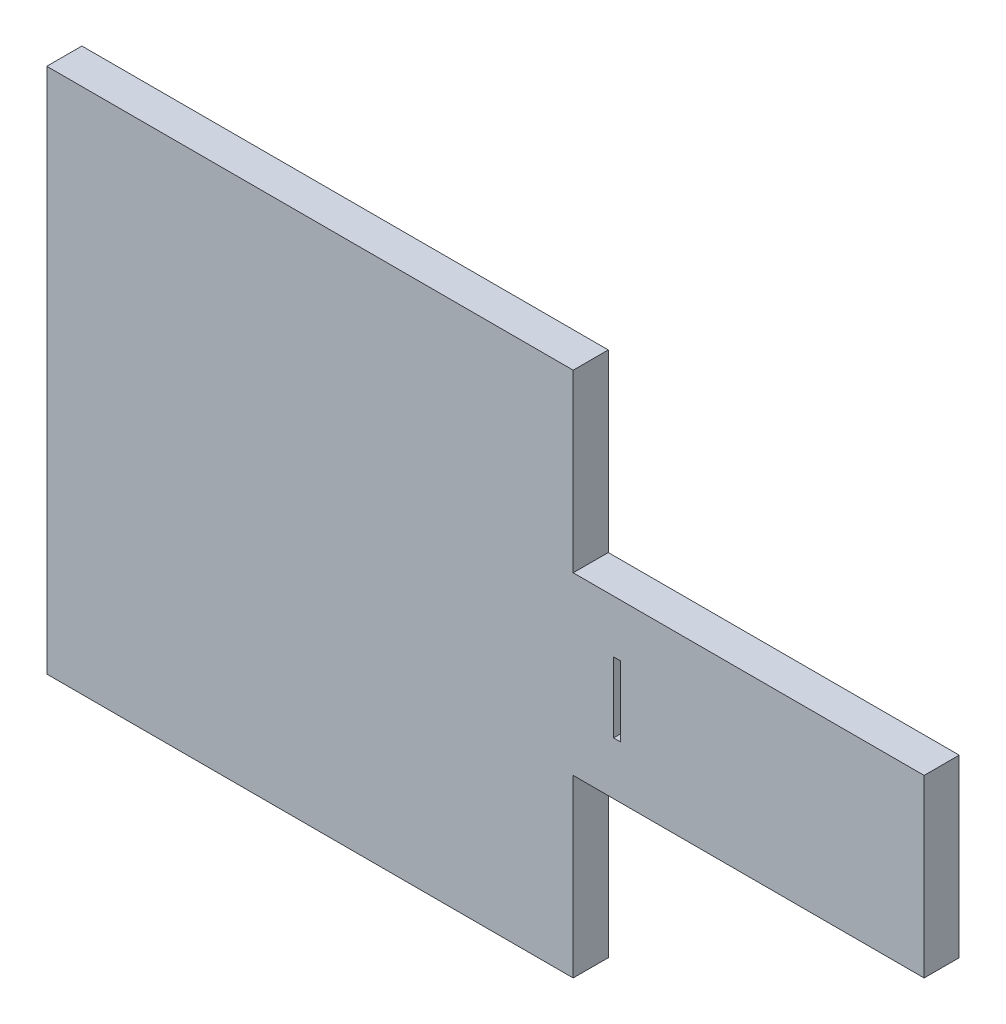
ISO-10303-21;
HEADER;
FILE_DESCRIPTION(('STEP AP214'),'2;1');
FILE_NAME('part.step','',(''),(''),'','','');
FILE_SCHEMA(('AUTOMOTIVE_DESIGN { 1 0 10303 214 1 1 1 1 }'));
ENDSEC;
DATA;
#1=APPLICATION_CONTEXT('core data for automotive mechanical design processes');
#2=APPLICATION_PROTOCOL_DEFINITION('international standard','automotive_design',2000,#1);
#3=PRODUCT_CONTEXT('',#1,'mechanical');
#4=PRODUCT('Part','Part','',(#3));
#5=PRODUCT_RELATED_PRODUCT_CATEGORY('part','',(#4));
#6=PRODUCT_DEFINITION_FORMATION('','',#4);
#7=PRODUCT_DEFINITION_CONTEXT('part definition',#1,'design');
#8=PRODUCT_DEFINITION('design','',#6,#7);
#9=PRODUCT_DEFINITION_SHAPE('','',#8);
#10=(LENGTH_UNIT() NAMED_UNIT(*) SI_UNIT(.MILLI.,.METRE.));
#11=(NAMED_UNIT(*) PLANE_ANGLE_UNIT() SI_UNIT($,.RADIAN.));
#12=(NAMED_UNIT(*) SI_UNIT($,.STERADIAN.) SOLID_ANGLE_UNIT());
#13=UNCERTAINTY_MEASURE_WITH_UNIT(LENGTH_MEASURE(1.E-05),#10,'distance_accuracy_value','');
#14=(GEOMETRIC_REPRESENTATION_CONTEXT(3) GLOBAL_UNCERTAINTY_ASSIGNED_CONTEXT((#13)) GLOBAL_UNIT_ASSIGNED_CONTEXT((#10,
#11,#12)) REPRESENTATION_CONTEXT('',''));
#15=CARTESIAN_POINT('',(0.,0.,0.));
#16=DIRECTION('',(0.,0.,1.));
#17=DIRECTION('',(1.,0.,0.));
#18=AXIS2_PLACEMENT_3D('',#15,#16,#17);
#19=CARTESIAN_POINT('',(0.,0.,2.54));
#20=DIRECTION('',(0.,0.,1.));
#21=DIRECTION('',(1.,0.,0.));
#22=AXIS2_PLACEMENT_3D('',#19,#20,#21);
#23=PLANE('',#22);
#24=DIRECTION('',(0.,1.,0.));
#25=VECTOR('',#24,1.);
#26=CARTESIAN_POINT('',(19.05,0.,2.54));
#27=LINE('',#26,#25);
#28=CARTESIAN_POINT('',(19.05,0.,2.54));
#29=VERTEX_POINT('',#28);
#30=CARTESIAN_POINT('',(19.05,12.7,2.54));
#31=VERTEX_POINT('',#30);
#32=EDGE_CURVE('E198',#29,#31,#27,.T.);
#33=ORIENTED_EDGE('',*,*,#32,.T.);
#34=DIRECTION('',(-1.,0.,0.));
#35=VECTOR('',#34,1.);
#36=CARTESIAN_POINT('',(19.05,12.7,2.54));
#37=LINE('',#36,#35);
#38=CARTESIAN_POINT('',(-6.35,12.7,2.54));
#39=VERTEX_POINT('',#38);
#40=EDGE_CURVE('E202',#31,#39,#37,.T.);
#41=ORIENTED_EDGE('',*,*,#40,.T.);
#42=DIRECTION('',(0.,1.,0.));
#43=VECTOR('',#42,1.);
#44=CARTESIAN_POINT('',(-6.35,12.7,2.54));
#45=LINE('',#44,#43);
#46=CARTESIAN_POINT('',(-6.35,25.4,2.54));
#47=VERTEX_POINT('',#46);
#48=EDGE_CURVE('E206',#39,#47,#45,.T.);
#49=ORIENTED_EDGE('',*,*,#48,.T.);
#50=DIRECTION('',(-1.,0.,0.));
#51=VECTOR('',#50,1.);
#52=CARTESIAN_POINT('',(-6.35,25.4,2.54));
#53=LINE('',#52,#51);
#54=CARTESIAN_POINT('',(-44.45,25.4,2.54));
#55=VERTEX_POINT('',#54);
#56=EDGE_CURVE('E209',#47,#55,#53,.T.);
#57=ORIENTED_EDGE('',*,*,#56,.T.);
#58=DIRECTION('',(0.,-1.,0.));
#59=VECTOR('',#58,1.);
#60=CARTESIAN_POINT('',(-44.45,-12.7,2.54));
#61=LINE('',#60,#59);
#62=CARTESIAN_POINT('',(-44.45,-12.7,2.54));
#63=VERTEX_POINT('',#62);
#64=EDGE_CURVE('E212',#55,#63,#61,.T.);
#65=ORIENTED_EDGE('',*,*,#64,.T.);
#66=DIRECTION('',(1.,0.,0.));
#67=VECTOR('',#66,1.);
#68=CARTESIAN_POINT('',(-44.45,-12.7,2.54));
#69=LINE('',#68,#67);
#70=CARTESIAN_POINT('',(-6.35,-12.7,2.54));
#71=VERTEX_POINT('',#70);
#72=EDGE_CURVE('E215',#63,#71,#69,.T.);
#73=ORIENTED_EDGE('',*,*,#72,.T.);
#74=DIRECTION('',(0.,1.,0.));
#75=VECTOR('',#74,1.);
#76=CARTESIAN_POINT('',(-6.35,-12.7,2.54));
#77=LINE('',#76,#75);
#78=CARTESIAN_POINT('',(-6.35,0.,2.54));
#79=VERTEX_POINT('',#78);
#80=EDGE_CURVE('E218',#71,#79,#77,.T.);
#81=ORIENTED_EDGE('',*,*,#80,.T.);
#82=DIRECTION('',(1.,0.,0.));
#83=VECTOR('',#82,1.);
#84=CARTESIAN_POINT('',(-6.35,0.,2.54));
#85=LINE('',#84,#83);
#86=EDGE_CURVE('E221',#79,#29,#85,.T.);
#87=ORIENTED_EDGE('',*,*,#86,.T.);
#88=EDGE_LOOP('',(#33,#41,#49,#57,#65,#73,#81,#87));
#89=FACE_BOUND('',#88,.T.);
#90=DIRECTION('',(-1.,0.,0.));
#91=VECTOR('',#90,1.);
#92=CARTESIAN_POINT('',(-3.429,8.89,2.54));
#93=LINE('',#92,#91);
#94=CARTESIAN_POINT('',(-2.921,8.89,2.54));
#95=VERTEX_POINT('',#94);
#96=CARTESIAN_POINT('',(-3.429,8.89,2.54));
#97=VERTEX_POINT('',#96);
#98=EDGE_CURVE('E159',#95,#97,#93,.T.);
#99=ORIENTED_EDGE('',*,*,#98,.F.);
#100=DIRECTION('',(0.,1.,0.));
#101=VECTOR('',#100,1.);
#102=CARTESIAN_POINT('',(-2.921,8.89,2.54));
#103=LINE('',#102,#101);
#104=CARTESIAN_POINT('',(-2.921,3.81,2.54));
#105=VERTEX_POINT('',#104);
#106=EDGE_CURVE('E150',#105,#95,#103,.T.);
#107=ORIENTED_EDGE('',*,*,#106,.F.);
#108=DIRECTION('',(1.,0.,0.));
#109=VECTOR('',#108,1.);
#110=CARTESIAN_POINT('',(-3.429,3.81,2.54));
#111=LINE('',#110,#109);
#112=CARTESIAN_POINT('',(-3.429,3.81,2.54));
#113=VERTEX_POINT('',#112);
#114=EDGE_CURVE('E176',#113,#105,#111,.T.);
#115=ORIENTED_EDGE('',*,*,#114,.F.);
#116=DIRECTION('',(0.,-1.,0.));
#117=VECTOR('',#116,1.);
#118=CARTESIAN_POINT('',(-3.429,8.89,2.54));
#119=LINE('',#118,#117);
#120=EDGE_CURVE('E172',#97,#113,#119,.T.);
#121=ORIENTED_EDGE('',*,*,#120,.F.);
#122=EDGE_LOOP('',(#99,#107,#115,#121));
#123=FACE_BOUND('',#122,.T.);
#124=ADVANCED_FACE('F36',(#89,#123),#23,.T.);
#125=CARTESIAN_POINT('',(0.,0.,0.));
#126=DIRECTION('',(0.,0.,1.));
#127=DIRECTION('',(1.,0.,0.));
#128=AXIS2_PLACEMENT_3D('',#125,#126,#127);
#129=PLANE('',#128);
#130=DIRECTION('',(0.,1.,0.));
#131=VECTOR('',#130,1.);
#132=CARTESIAN_POINT('',(19.05,0.,0.));
#133=LINE('',#132,#131);
#134=CARTESIAN_POINT('',(19.05,0.,0.));
#135=VERTEX_POINT('',#134);
#136=CARTESIAN_POINT('',(19.05,12.7,0.));
#137=VERTEX_POINT('',#136);
#138=EDGE_CURVE('E168',#135,#137,#133,.T.);
#139=ORIENTED_EDGE('',*,*,#138,.F.);
#140=DIRECTION('',(1.,0.,0.));
#141=VECTOR('',#140,1.);
#142=CARTESIAN_POINT('',(-6.35,0.,0.));
#143=LINE('',#142,#141);
#144=CARTESIAN_POINT('',(-6.35,0.,0.));
#145=VERTEX_POINT('',#144);
#146=EDGE_CURVE('E203',#145,#135,#143,.T.);
#147=ORIENTED_EDGE('',*,*,#146,.F.);
#148=DIRECTION('',(0.,1.,0.));
#149=VECTOR('',#148,1.);
#150=CARTESIAN_POINT('',(-6.35,-12.7,0.));
#151=LINE('',#150,#149);
#152=CARTESIAN_POINT('',(-6.35,-12.7,0.));
#153=VERTEX_POINT('',#152);
#154=EDGE_CURVE('E243',#153,#145,#151,.T.);
#155=ORIENTED_EDGE('',*,*,#154,.F.);
#156=DIRECTION('',(1.,0.,0.));
#157=VECTOR('',#156,1.);
#158=CARTESIAN_POINT('',(-44.45,-12.7,0.));
#159=LINE('',#158,#157);
#160=CARTESIAN_POINT('',(-44.45,-12.7,0.));
#161=VERTEX_POINT('',#160);
#162=EDGE_CURVE('E240',#161,#153,#159,.T.);
#163=ORIENTED_EDGE('',*,*,#162,.F.);
#164=DIRECTION('',(0.,-1.,0.));
#165=VECTOR('',#164,1.);
#166=CARTESIAN_POINT('',(-44.45,-12.7,0.));
#167=LINE('',#166,#165);
#168=CARTESIAN_POINT('',(-44.45,25.4,0.));
#169=VERTEX_POINT('',#168);
#170=EDGE_CURVE('E237',#169,#161,#167,.T.);
#171=ORIENTED_EDGE('',*,*,#170,.F.);
#172=DIRECTION('',(-1.,0.,0.));
#173=VECTOR('',#172,1.);
#174=CARTESIAN_POINT('',(-6.35,25.4,0.));
#175=LINE('',#174,#173);
#176=CARTESIAN_POINT('',(-6.35,25.4,0.));
#177=VERTEX_POINT('',#176);
#178=EDGE_CURVE('E234',#177,#169,#175,.T.);
#179=ORIENTED_EDGE('',*,*,#178,.F.);
#180=DIRECTION('',(0.,1.,0.));
#181=VECTOR('',#180,1.);
#182=CARTESIAN_POINT('',(-6.35,12.7,0.));
#183=LINE('',#182,#181);
#184=CARTESIAN_POINT('',(-6.35,12.7,0.));
#185=VERTEX_POINT('',#184);
#186=EDGE_CURVE('E231',#185,#177,#183,.T.);
#187=ORIENTED_EDGE('',*,*,#186,.F.);
#188=DIRECTION('',(-1.,0.,0.));
#189=VECTOR('',#188,1.);
#190=CARTESIAN_POINT('',(19.05,12.7,0.));
#191=LINE('',#190,#189);
#192=EDGE_CURVE('E228',#137,#185,#191,.T.);
#193=ORIENTED_EDGE('',*,*,#192,.F.);
#194=EDGE_LOOP('',(#139,#147,#155,#163,#171,#179,#187,#193));
#195=FACE_BOUND('',#194,.T.);
#196=DIRECTION('',(0.,1.,0.));
#197=VECTOR('',#196,1.);
#198=CARTESIAN_POINT('',(-2.921,8.89,0.));
#199=LINE('',#198,#197);
#200=CARTESIAN_POINT('',(-2.921,3.81,0.));
#201=VERTEX_POINT('',#200);
#202=CARTESIAN_POINT('',(-2.921,8.89,0.));
#203=VERTEX_POINT('',#202);
#204=EDGE_CURVE('E66',#201,#203,#199,.T.);
#205=ORIENTED_EDGE('',*,*,#204,.T.);
#206=DIRECTION('',(-1.,0.,0.));
#207=VECTOR('',#206,1.);
#208=CARTESIAN_POINT('',(-3.429,8.89,0.));
#209=LINE('',#208,#207);
#210=CARTESIAN_POINT('',(-3.429,8.89,0.));
#211=VERTEX_POINT('',#210);
#212=EDGE_CURVE('E166',#203,#211,#209,.T.);
#213=ORIENTED_EDGE('',*,*,#212,.T.);
#214=DIRECTION('',(0.,-1.,0.));
#215=VECTOR('',#214,1.);
#216=CARTESIAN_POINT('',(-3.429,8.89,0.));
#217=LINE('',#216,#215);
#218=CARTESIAN_POINT('',(-3.429,3.81,0.));
#219=VERTEX_POINT('',#218);
#220=EDGE_CURVE('E185',#211,#219,#217,.T.);
#221=ORIENTED_EDGE('',*,*,#220,.T.);
#222=DIRECTION('',(1.,0.,0.));
#223=VECTOR('',#222,1.);
#224=CARTESIAN_POINT('',(-3.429,3.81,0.));
#225=LINE('',#224,#223);
#226=EDGE_CURVE('E160',#219,#201,#225,.T.);
#227=ORIENTED_EDGE('',*,*,#226,.T.);
#228=EDGE_LOOP('',(#205,#213,#221,#227));
#229=FACE_BOUND('',#228,.T.);
#230=ADVANCED_FACE('F282',(#195,#229),#129,.F.);
#231=CARTESIAN_POINT('',(19.05,0.,2.54));
#232=DIRECTION('',(-1.,0.,0.));
#233=DIRECTION('',(0.,0.,1.));
#234=AXIS2_PLACEMENT_3D('',#231,#232,#233);
#235=PLANE('',#234);
#236=ORIENTED_EDGE('',*,*,#138,.T.);
#237=DIRECTION('',(0.,0.,-1.));
#238=VECTOR('',#237,1.);
#239=CARTESIAN_POINT('',(19.05,12.7,2.54));
#240=LINE('',#239,#238);
#241=EDGE_CURVE('E11',#31,#137,#240,.T.);
#242=ORIENTED_EDGE('',*,*,#241,.F.);
#243=ORIENTED_EDGE('',*,*,#32,.F.);
#244=DIRECTION('',(0.,0.,-1.));
#245=VECTOR('',#244,1.);
#246=CARTESIAN_POINT('',(19.05,0.,2.54));
#247=LINE('',#246,#245);
#248=EDGE_CURVE('E224',#29,#135,#247,.T.);
#249=ORIENTED_EDGE('',*,*,#248,.T.);
#250=EDGE_LOOP('',(#236,#242,#243,#249));
#251=FACE_BOUND('',#250,.T.);
#252=ADVANCED_FACE('F38',(#251),#235,.F.);
#253=CARTESIAN_POINT('',(19.05,12.7,2.54));
#254=DIRECTION('',(0.,-1.,0.));
#255=DIRECTION('',(1.,0.,0.));
#256=AXIS2_PLACEMENT_3D('',#253,#254,#255);
#257=PLANE('',#256);
#258=ORIENTED_EDGE('',*,*,#192,.T.);
#259=DIRECTION('',(0.,0.,-1.));
#260=VECTOR('',#259,1.);
#261=CARTESIAN_POINT('',(-6.35,12.7,2.54));
#262=LINE('',#261,#260);
#263=EDGE_CURVE('E45',#39,#185,#262,.T.);
#264=ORIENTED_EDGE('',*,*,#263,.F.);
#265=ORIENTED_EDGE('',*,*,#40,.F.);
#266=ORIENTED_EDGE('',*,*,#241,.T.);
#267=EDGE_LOOP('',(#258,#264,#265,#266));
#268=FACE_BOUND('',#267,.T.);
#269=ADVANCED_FACE('F299',(#268),#257,.F.);
#270=CARTESIAN_POINT('',(-6.35,12.7,2.54));
#271=DIRECTION('',(-1.,0.,0.));
#272=DIRECTION('',(0.,0.,1.));
#273=AXIS2_PLACEMENT_3D('',#270,#271,#272);
#274=PLANE('',#273);
#275=ORIENTED_EDGE('',*,*,#186,.T.);
#276=DIRECTION('',(0.,0.,-1.));
#277=VECTOR('',#276,1.);
#278=CARTESIAN_POINT('',(-6.35,25.4,2.54));
#279=LINE('',#278,#277);
#280=EDGE_CURVE('E267',#47,#177,#279,.T.);
#281=ORIENTED_EDGE('',*,*,#280,.F.);
#282=ORIENTED_EDGE('',*,*,#48,.F.);
#283=ORIENTED_EDGE('',*,*,#263,.T.);
#284=EDGE_LOOP('',(#275,#281,#282,#283));
#285=FACE_BOUND('',#284,.T.);
#286=ADVANCED_FACE('F276',(#285),#274,.F.);
#287=CARTESIAN_POINT('',(-6.35,25.4,2.54));
#288=DIRECTION('',(0.,-1.,0.));
#289=DIRECTION('',(1.,0.,0.));
#290=AXIS2_PLACEMENT_3D('',#287,#288,#289);
#291=PLANE('',#290);
#292=ORIENTED_EDGE('',*,*,#178,.T.);
#293=DIRECTION('',(0.,0.,-1.));
#294=VECTOR('',#293,1.);
#295=CARTESIAN_POINT('',(-44.45,25.4,2.54));
#296=LINE('',#295,#294);
#297=EDGE_CURVE('E263',#55,#169,#296,.T.);
#298=ORIENTED_EDGE('',*,*,#297,.F.);
#299=ORIENTED_EDGE('',*,*,#56,.F.);
#300=ORIENTED_EDGE('',*,*,#280,.T.);
#301=EDGE_LOOP('',(#292,#298,#299,#300));
#302=FACE_BOUND('',#301,.T.);
#303=ADVANCED_FACE('F288',(#302),#291,.F.);
#304=CARTESIAN_POINT('',(-44.45,-12.7,2.54));
#305=DIRECTION('',(1.,0.,0.));
#306=DIRECTION('',(0.,0.,-1.));
#307=AXIS2_PLACEMENT_3D('',#304,#305,#306);
#308=PLANE('',#307);
#309=ORIENTED_EDGE('',*,*,#170,.T.);
#310=DIRECTION('',(0.,0.,-1.));
#311=VECTOR('',#310,1.);
#312=CARTESIAN_POINT('',(-44.45,-12.7,2.54));
#313=LINE('',#312,#311);
#314=EDGE_CURVE('E259',#63,#161,#313,.T.);
#315=ORIENTED_EDGE('',*,*,#314,.F.);
#316=ORIENTED_EDGE('',*,*,#64,.F.);
#317=ORIENTED_EDGE('',*,*,#297,.T.);
#318=EDGE_LOOP('',(#309,#315,#316,#317));
#319=FACE_BOUND('',#318,.T.);
#320=ADVANCED_FACE('F292',(#319),#308,.F.);
#321=CARTESIAN_POINT('',(-44.45,-12.7,2.54));
#322=DIRECTION('',(0.,1.,0.));
#323=DIRECTION('',(0.,0.,1.));
#324=AXIS2_PLACEMENT_3D('',#321,#322,#323);
#325=PLANE('',#324);
#326=ORIENTED_EDGE('',*,*,#162,.T.);
#327=DIRECTION('',(0.,0.,-1.));
#328=VECTOR('',#327,1.);
#329=CARTESIAN_POINT('',(-6.35,-12.7,2.54));
#330=LINE('',#329,#328);
#331=EDGE_CURVE('E255',#71,#153,#330,.T.);
#332=ORIENTED_EDGE('',*,*,#331,.F.);
#333=ORIENTED_EDGE('',*,*,#72,.F.);
#334=ORIENTED_EDGE('',*,*,#314,.T.);
#335=EDGE_LOOP('',(#326,#332,#333,#334));
#336=FACE_BOUND('',#335,.T.);
#337=ADVANCED_FACE('F312',(#336),#325,.F.);
#338=CARTESIAN_POINT('',(-6.35,-12.7,2.54));
#339=DIRECTION('',(-1.,0.,0.));
#340=DIRECTION('',(0.,-1.,0.));
#341=AXIS2_PLACEMENT_3D('',#338,#339,#340);
#342=PLANE('',#341);
#343=ORIENTED_EDGE('',*,*,#154,.T.);
#344=DIRECTION('',(0.,0.,-1.));
#345=VECTOR('',#344,1.);
#346=CARTESIAN_POINT('',(-6.35,0.,2.54));
#347=LINE('',#346,#345);
#348=EDGE_CURVE('E251',#79,#145,#347,.T.);
#349=ORIENTED_EDGE('',*,*,#348,.F.);
#350=ORIENTED_EDGE('',*,*,#80,.F.);
#351=ORIENTED_EDGE('',*,*,#331,.T.);
#352=EDGE_LOOP('',(#343,#349,#350,#351));
#353=FACE_BOUND('',#352,.T.);
#354=ADVANCED_FACE('F310',(#353),#342,.F.);
#355=CARTESIAN_POINT('',(-6.35,0.,2.54));
#356=DIRECTION('',(0.,1.,0.));
#357=DIRECTION('',(-1.,0.,0.));
#358=AXIS2_PLACEMENT_3D('',#355,#356,#357);
#359=PLANE('',#358);
#360=ORIENTED_EDGE('',*,*,#146,.T.);
#361=ORIENTED_EDGE('',*,*,#248,.F.);
#362=ORIENTED_EDGE('',*,*,#86,.F.);
#363=ORIENTED_EDGE('',*,*,#348,.T.);
#364=EDGE_LOOP('',(#360,#361,#362,#363));
#365=FACE_BOUND('',#364,.T.);
#366=ADVANCED_FACE('F305',(#365),#359,.F.);
#367=CARTESIAN_POINT('',(-2.921,8.89,2.54));
#368=DIRECTION('',(-1.,0.,0.));
#369=DIRECTION('',(0.,-1.,0.));
#370=AXIS2_PLACEMENT_3D('',#367,#368,#369);
#371=PLANE('',#370);
#372=ORIENTED_EDGE('',*,*,#204,.F.);
#373=DIRECTION('',(0.,0.,-1.));
#374=VECTOR('',#373,1.);
#375=CARTESIAN_POINT('',(-2.921,3.81,2.54));
#376=LINE('',#375,#374);
#377=EDGE_CURVE('E154',#105,#201,#376,.T.);
#378=ORIENTED_EDGE('',*,*,#377,.F.);
#379=ORIENTED_EDGE('',*,*,#106,.T.);
#380=DIRECTION('',(0.,0.,-1.));
#381=VECTOR('',#380,1.);
#382=CARTESIAN_POINT('',(-2.921,8.89,2.54));
#383=LINE('',#382,#381);
#384=EDGE_CURVE('E153',#95,#203,#383,.T.);
#385=ORIENTED_EDGE('',*,*,#384,.T.);
#386=EDGE_LOOP('',(#372,#378,#379,#385));
#387=FACE_BOUND('',#386,.T.);
#388=ADVANCED_FACE('F152',(#387),#371,.T.);
#389=CARTESIAN_POINT('',(-3.429,8.89,2.54));
#390=DIRECTION('',(0.,-1.,0.));
#391=DIRECTION('',(0.,0.,-1.));
#392=AXIS2_PLACEMENT_3D('',#389,#390,#391);
#393=PLANE('',#392);
#394=ORIENTED_EDGE('',*,*,#212,.F.);
#395=ORIENTED_EDGE('',*,*,#384,.F.);
#396=ORIENTED_EDGE('',*,*,#98,.T.);
#397=DIRECTION('',(0.,0.,-1.));
#398=VECTOR('',#397,1.);
#399=CARTESIAN_POINT('',(-3.429,8.89,2.54));
#400=LINE('',#399,#398);
#401=EDGE_CURVE('E169',#97,#211,#400,.T.);
#402=ORIENTED_EDGE('',*,*,#401,.T.);
#403=EDGE_LOOP('',(#394,#395,#396,#402));
#404=FACE_BOUND('',#403,.T.);
#405=ADVANCED_FACE('F163',(#404),#393,.T.);
#406=CARTESIAN_POINT('',(-3.429,8.89,2.54));
#407=DIRECTION('',(1.,0.,0.));
#408=DIRECTION('',(0.,1.,0.));
#409=AXIS2_PLACEMENT_3D('',#406,#407,#408);
#410=PLANE('',#409);
#411=ORIENTED_EDGE('',*,*,#220,.F.);
#412=ORIENTED_EDGE('',*,*,#401,.F.);
#413=ORIENTED_EDGE('',*,*,#120,.T.);
#414=DIRECTION('',(0.,0.,-1.));
#415=VECTOR('',#414,1.);
#416=CARTESIAN_POINT('',(-3.429,3.81,2.54));
#417=LINE('',#416,#415);
#418=EDGE_CURVE('E55',#113,#219,#417,.T.);
#419=ORIENTED_EDGE('',*,*,#418,.T.);
#420=EDGE_LOOP('',(#411,#412,#413,#419));
#421=FACE_BOUND('',#420,.T.);
#422=ADVANCED_FACE('F337',(#421),#410,.T.);
#423=CARTESIAN_POINT('',(-3.429,3.81,2.54));
#424=DIRECTION('',(0.,1.,0.));
#425=DIRECTION('',(0.,0.,1.));
#426=AXIS2_PLACEMENT_3D('',#423,#424,#425);
#427=PLANE('',#426);
#428=ORIENTED_EDGE('',*,*,#226,.F.);
#429=ORIENTED_EDGE('',*,*,#418,.F.);
#430=ORIENTED_EDGE('',*,*,#114,.T.);
#431=ORIENTED_EDGE('',*,*,#377,.T.);
#432=EDGE_LOOP('',(#428,#429,#430,#431));
#433=FACE_BOUND('',#432,.T.);
#434=ADVANCED_FACE('F341',(#433),#427,.T.);
#435=CLOSED_SHELL('',(#124,#230,#252,#269,#286,#303,#320,#337,#354,#366,#388,#405,#422,#434));
#436=MANIFOLD_SOLID_BREP('B2',#435);
#437=ADVANCED_BREP_SHAPE_REPRESENTATION('',(#18,#436),#14);
#438=SHAPE_DEFINITION_REPRESENTATION(#9,#437);
ENDSEC;
END-ISO-10303-21;
